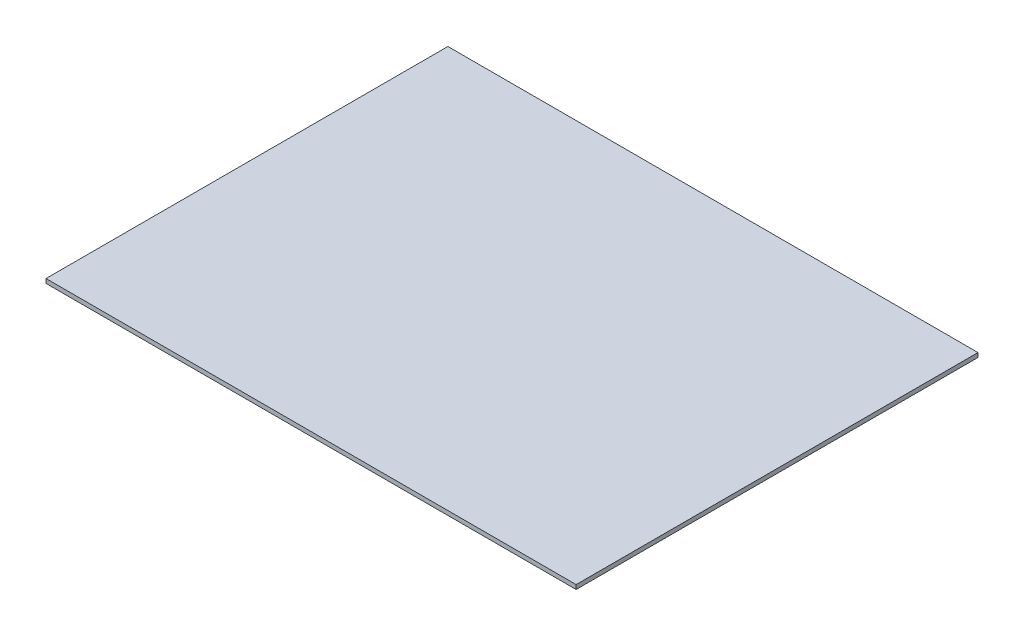
ISO-10303-21;
HEADER;
FILE_DESCRIPTION(('STEP AP214'),'2;1');
FILE_NAME('part.step','',(''),(''),'','','');
FILE_SCHEMA(('AUTOMOTIVE_DESIGN { 1 0 10303 214 1 1 1 1 }'));
ENDSEC;
DATA;
#1=APPLICATION_CONTEXT('core data for automotive mechanical design processes');
#2=APPLICATION_PROTOCOL_DEFINITION('international standard','automotive_design',2000,#1);
#3=PRODUCT_CONTEXT('',#1,'mechanical');
#4=PRODUCT('Part','Part','',(#3));
#5=PRODUCT_RELATED_PRODUCT_CATEGORY('part','',(#4));
#6=PRODUCT_DEFINITION_FORMATION('','',#4);
#7=PRODUCT_DEFINITION_CONTEXT('part definition',#1,'design');
#8=PRODUCT_DEFINITION('design','',#6,#7);
#9=PRODUCT_DEFINITION_SHAPE('','',#8);
#10=(LENGTH_UNIT() NAMED_UNIT(*) SI_UNIT(.MILLI.,.METRE.));
#11=(NAMED_UNIT(*) PLANE_ANGLE_UNIT() SI_UNIT($,.RADIAN.));
#12=(NAMED_UNIT(*) SI_UNIT($,.STERADIAN.) SOLID_ANGLE_UNIT());
#13=UNCERTAINTY_MEASURE_WITH_UNIT(LENGTH_MEASURE(1.E-05),#10,'distance_accuracy_value','');
#14=(GEOMETRIC_REPRESENTATION_CONTEXT(3) GLOBAL_UNCERTAINTY_ASSIGNED_CONTEXT((#13)) GLOBAL_UNIT_ASSIGNED_CONTEXT((#10,
#11,#12)) REPRESENTATION_CONTEXT('',''));
#15=CARTESIAN_POINT('',(0.,0.,0.));
#16=DIRECTION('',(0.,0.,1.));
#17=DIRECTION('',(1.,0.,0.));
#18=AXIS2_PLACEMENT_3D('',#15,#16,#17);
#19=CARTESIAN_POINT('',(787.4,12.7,596.9));
#20=DIRECTION('',(-1.,0.,0.));
#21=DIRECTION('',(0.,0.,1.));
#22=AXIS2_PLACEMENT_3D('',#19,#20,#21);
#23=PLANE('',#22);
#24=DIRECTION('',(0.,0.,-1.));
#25=VECTOR('',#24,1.);
#26=CARTESIAN_POINT('',(787.4,0.,596.9));
#27=LINE('',#26,#25);
#28=CARTESIAN_POINT('',(787.4,0.,596.9));
#29=VERTEX_POINT('',#28);
#30=CARTESIAN_POINT('',(787.4,0.,-596.9));
#31=VERTEX_POINT('',#30);
#32=EDGE_CURVE('E96',#29,#31,#27,.T.);
#33=ORIENTED_EDGE('',*,*,#32,.T.);
#34=DIRECTION('',(0.,-1.,0.));
#35=VECTOR('',#34,1.);
#36=CARTESIAN_POINT('',(787.4,12.7,-596.9));
#37=LINE('',#36,#35);
#38=CARTESIAN_POINT('',(787.4,12.7,-596.9));
#39=VERTEX_POINT('',#38);
#40=EDGE_CURVE('E11',#39,#31,#37,.T.);
#41=ORIENTED_EDGE('',*,*,#40,.F.);
#42=DIRECTION('',(0.,0.,-1.));
#43=VECTOR('',#42,1.);
#44=CARTESIAN_POINT('',(787.4,12.7,596.9));
#45=LINE('',#44,#43);
#46=CARTESIAN_POINT('',(787.4,12.7,596.9));
#47=VERTEX_POINT('',#46);
#48=EDGE_CURVE('E84',#47,#39,#45,.T.);
#49=ORIENTED_EDGE('',*,*,#48,.F.);
#50=DIRECTION('',(0.,-1.,0.));
#51=VECTOR('',#50,1.);
#52=CARTESIAN_POINT('',(787.4,12.7,596.9));
#53=LINE('',#52,#51);
#54=EDGE_CURVE('E92',#47,#29,#53,.T.);
#55=ORIENTED_EDGE('',*,*,#54,.T.);
#56=EDGE_LOOP('',(#33,#41,#49,#55));
#57=FACE_BOUND('',#56,.T.);
#58=ADVANCED_FACE('F33',(#57),#23,.F.);
#59=CARTESIAN_POINT('',(-787.4,12.7,-596.9));
#60=DIRECTION('',(0.,0.,1.));
#61=DIRECTION('',(1.,0.,0.));
#62=AXIS2_PLACEMENT_3D('',#59,#60,#61);
#63=PLANE('',#62);
#64=DIRECTION('',(-1.,0.,0.));
#65=VECTOR('',#64,1.);
#66=CARTESIAN_POINT('',(-787.4,0.,-596.9));
#67=LINE('',#66,#65);
#68=CARTESIAN_POINT('',(-787.4,0.,-596.9));
#69=VERTEX_POINT('',#68);
#70=EDGE_CURVE('E88',#31,#69,#67,.T.);
#71=ORIENTED_EDGE('',*,*,#70,.T.);
#72=DIRECTION('',(0.,-1.,0.));
#73=VECTOR('',#72,1.);
#74=CARTESIAN_POINT('',(-787.4,12.7,-596.9));
#75=LINE('',#74,#73);
#76=CARTESIAN_POINT('',(-787.4,12.7,-596.9));
#77=VERTEX_POINT('',#76);
#78=EDGE_CURVE('E41',#77,#69,#75,.T.);
#79=ORIENTED_EDGE('',*,*,#78,.F.);
#80=DIRECTION('',(-1.,0.,0.));
#81=VECTOR('',#80,1.);
#82=CARTESIAN_POINT('',(-787.4,12.7,-596.9));
#83=LINE('',#82,#81);
#84=EDGE_CURVE('E79',#39,#77,#83,.T.);
#85=ORIENTED_EDGE('',*,*,#84,.F.);
#86=ORIENTED_EDGE('',*,*,#40,.T.);
#87=EDGE_LOOP('',(#71,#79,#85,#86));
#88=FACE_BOUND('',#87,.T.);
#89=ADVANCED_FACE('F87',(#88),#63,.F.);
#90=CARTESIAN_POINT('',(-787.4,12.7,596.9));
#91=DIRECTION('',(1.,0.,0.));
#92=DIRECTION('',(0.,0.,-1.));
#93=AXIS2_PLACEMENT_3D('',#90,#91,#92);
#94=PLANE('',#93);
#95=DIRECTION('',(0.,0.,1.));
#96=VECTOR('',#95,1.);
#97=CARTESIAN_POINT('',(-787.4,0.,596.9));
#98=LINE('',#97,#96);
#99=CARTESIAN_POINT('',(-787.4,0.,596.9));
#100=VERTEX_POINT('',#99);
#101=EDGE_CURVE('E66',#69,#100,#98,.T.);
#102=ORIENTED_EDGE('',*,*,#101,.T.);
#103=DIRECTION('',(0.,-1.,0.));
#104=VECTOR('',#103,1.);
#105=CARTESIAN_POINT('',(-787.4,12.7,596.9));
#106=LINE('',#105,#104);
#107=CARTESIAN_POINT('',(-787.4,12.7,596.9));
#108=VERTEX_POINT('',#107);
#109=EDGE_CURVE('E89',#108,#100,#106,.T.);
#110=ORIENTED_EDGE('',*,*,#109,.F.);
#111=DIRECTION('',(0.,0.,1.));
#112=VECTOR('',#111,1.);
#113=CARTESIAN_POINT('',(-787.4,12.7,596.9));
#114=LINE('',#113,#112);
#115=EDGE_CURVE('E82',#77,#108,#114,.T.);
#116=ORIENTED_EDGE('',*,*,#115,.F.);
#117=ORIENTED_EDGE('',*,*,#78,.T.);
#118=EDGE_LOOP('',(#102,#110,#116,#117));
#119=FACE_BOUND('',#118,.T.);
#120=ADVANCED_FACE('F90',(#119),#94,.F.);
#121=CARTESIAN_POINT('',(-787.4,12.7,596.9));
#122=DIRECTION('',(0.,0.,-1.));
#123=DIRECTION('',(-1.,0.,0.));
#124=AXIS2_PLACEMENT_3D('',#121,#122,#123);
#125=PLANE('',#124);
#126=DIRECTION('',(1.,0.,0.));
#127=VECTOR('',#126,1.);
#128=CARTESIAN_POINT('',(-787.4,0.,596.9));
#129=LINE('',#128,#127);
#130=EDGE_CURVE('E72',#100,#29,#129,.T.);
#131=ORIENTED_EDGE('',*,*,#130,.T.);
#132=ORIENTED_EDGE('',*,*,#54,.F.);
#133=DIRECTION('',(1.,0.,0.));
#134=VECTOR('',#133,1.);
#135=CARTESIAN_POINT('',(-787.4,12.7,596.9));
#136=LINE('',#135,#134);
#137=EDGE_CURVE('E49',#108,#47,#136,.T.);
#138=ORIENTED_EDGE('',*,*,#137,.F.);
#139=ORIENTED_EDGE('',*,*,#109,.T.);
#140=EDGE_LOOP('',(#131,#132,#138,#139));
#141=FACE_BOUND('',#140,.T.);
#142=ADVANCED_FACE('F103',(#141),#125,.F.);
#143=CARTESIAN_POINT('',(0.,12.7,0.));
#144=DIRECTION('',(0.,-1.,0.));
#145=DIRECTION('',(0.,0.,-1.));
#146=AXIS2_PLACEMENT_3D('',#143,#144,#145);
#147=PLANE('',#146);
#148=ORIENTED_EDGE('',*,*,#48,.T.);
#149=ORIENTED_EDGE('',*,*,#84,.T.);
#150=ORIENTED_EDGE('',*,*,#115,.T.);
#151=ORIENTED_EDGE('',*,*,#137,.T.);
#152=EDGE_LOOP('',(#148,#149,#150,#151));
#153=FACE_BOUND('',#152,.T.);
#154=ADVANCED_FACE('F80',(#153),#147,.F.);
#155=CARTESIAN_POINT('',(0.,0.,0.));
#156=DIRECTION('',(0.,-1.,0.));
#157=DIRECTION('',(0.,0.,-1.));
#158=AXIS2_PLACEMENT_3D('',#155,#156,#157);
#159=PLANE('',#158);
#160=ORIENTED_EDGE('',*,*,#32,.F.);
#161=ORIENTED_EDGE('',*,*,#130,.F.);
#162=ORIENTED_EDGE('',*,*,#101,.F.);
#163=ORIENTED_EDGE('',*,*,#70,.F.);
#164=EDGE_LOOP('',(#160,#161,#162,#163));
#165=FACE_BOUND('',#164,.T.);
#166=ADVANCED_FACE('F106',(#165),#159,.T.);
#167=CLOSED_SHELL('',(#58,#89,#120,#142,#154,#166));
#168=MANIFOLD_SOLID_BREP('B2',#167);
#169=ADVANCED_BREP_SHAPE_REPRESENTATION('',(#18,#168),#14);
#170=SHAPE_DEFINITION_REPRESENTATION(#9,#169);
ENDSEC;
END-ISO-10303-21;
